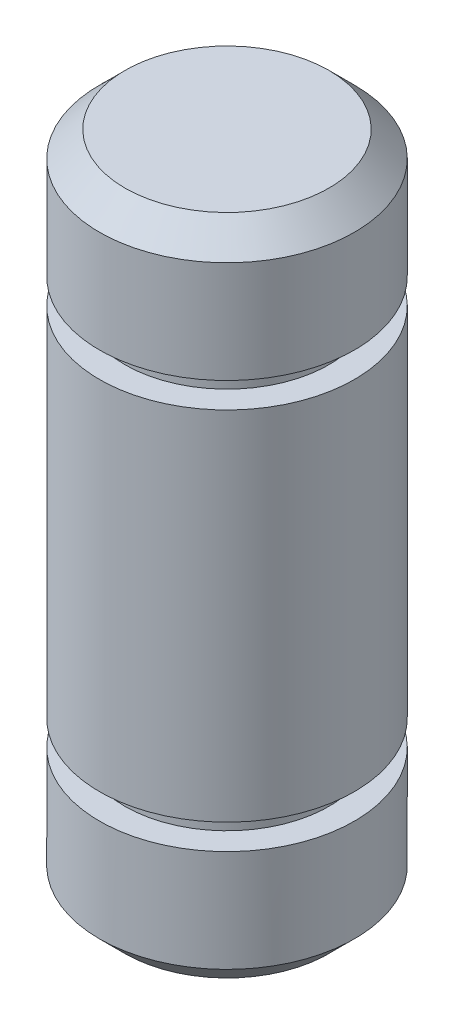
ISO-10303-21;
HEADER;
FILE_DESCRIPTION(('STEP AP214'),'2;1');
FILE_NAME('part.step','',(''),(''),'','','');
FILE_SCHEMA(('AUTOMOTIVE_DESIGN { 1 0 10303 214 1 1 1 1 }'));
ENDSEC;
DATA;
#1=APPLICATION_CONTEXT('core data for automotive mechanical design processes');
#2=APPLICATION_PROTOCOL_DEFINITION('international standard','automotive_design',2000,#1);
#3=PRODUCT_CONTEXT('',#1,'mechanical');
#4=PRODUCT('Part','Part','',(#3));
#5=PRODUCT_RELATED_PRODUCT_CATEGORY('part','',(#4));
#6=PRODUCT_DEFINITION_FORMATION('','',#4);
#7=PRODUCT_DEFINITION_CONTEXT('part definition',#1,'design');
#8=PRODUCT_DEFINITION('design','',#6,#7);
#9=PRODUCT_DEFINITION_SHAPE('','',#8);
#10=(LENGTH_UNIT() NAMED_UNIT(*) SI_UNIT(.MILLI.,.METRE.));
#11=(NAMED_UNIT(*) PLANE_ANGLE_UNIT() SI_UNIT($,.RADIAN.));
#12=(NAMED_UNIT(*) SI_UNIT($,.STERADIAN.) SOLID_ANGLE_UNIT());
#13=UNCERTAINTY_MEASURE_WITH_UNIT(LENGTH_MEASURE(1.E-05),#10,'distance_accuracy_value','');
#14=(GEOMETRIC_REPRESENTATION_CONTEXT(3) GLOBAL_UNCERTAINTY_ASSIGNED_CONTEXT((#13)) GLOBAL_UNIT_ASSIGNED_CONTEXT((#10,
#11,#12)) REPRESENTATION_CONTEXT('',''));
#15=CARTESIAN_POINT('',(0.,0.,0.));
#16=DIRECTION('',(0.,0.,1.));
#17=DIRECTION('',(1.,0.,0.));
#18=AXIS2_PLACEMENT_3D('',#15,#16,#17);
#19=CARTESIAN_POINT('',(0.,26.,0.));
#20=DIRECTION('',(0.,-1.,0.));
#21=DIRECTION('',(0.,0.,-1.));
#22=AXIS2_PLACEMENT_3D('',#19,#20,#21);
#23=CYLINDRICAL_SURFACE('',#22,5.);
#24=CARTESIAN_POINT('',(0.,20.,0.));
#25=DIRECTION('',(0.,-1.,0.));
#26=DIRECTION('',(0.,0.,-1.));
#27=AXIS2_PLACEMENT_3D('',#24,#25,#26);
#28=CIRCLE('',#27,5.);
#29=CARTESIAN_POINT('',(0.,20.,-5.));
#30=VERTEX_POINT('',#29);
#31=EDGE_CURVE('E73',#30,#30,#28,.T.);
#32=CARTESIAN_POINT('',(0.,6.,0.));
#33=DIRECTION('',(0.,-1.,0.));
#34=DIRECTION('',(0.,0.,-1.));
#35=AXIS2_PLACEMENT_3D('',#32,#33,#34);
#36=CIRCLE('',#35,5.);
#37=CARTESIAN_POINT('',(0.,6.00000000000001,-5.));
#38=VERTEX_POINT('',#37);
#39=EDGE_CURVE('E68',#38,#38,#36,.T.);
#40=CARTESIAN_POINT('',(0.,20.,-5.));
#41=CARTESIAN_POINT('',(0.,19.8541666666667,-5.));
#42=CARTESIAN_POINT('',(0.,19.7083333333333,-5.));
#43=CARTESIAN_POINT('',(0.,19.4166666666667,-5.));
#44=CARTESIAN_POINT('',(0.,19.2708333333333,-5.));
#45=CARTESIAN_POINT('',(0.,18.9791666666667,-5.));
#46=CARTESIAN_POINT('',(0.,18.8333333333333,-5.));
#47=CARTESIAN_POINT('',(0.,18.5416666666667,-5.));
#48=CARTESIAN_POINT('',(0.,18.3958333333333,-5.));
#49=CARTESIAN_POINT('',(0.,18.1041666666667,-5.));
#50=CARTESIAN_POINT('',(0.,17.9583333333333,-5.));
#51=CARTESIAN_POINT('',(0.,17.6666666666667,-5.));
#52=CARTESIAN_POINT('',(0.,17.5208333333333,-5.));
#53=CARTESIAN_POINT('',(0.,17.2291666666667,-5.));
#54=CARTESIAN_POINT('',(0.,17.0833333333333,-5.));
#55=CARTESIAN_POINT('',(0.,16.7916666666667,-5.));
#56=CARTESIAN_POINT('',(0.,16.6458333333333,-5.));
#57=CARTESIAN_POINT('',(0.,16.3541666666667,-5.));
#58=CARTESIAN_POINT('',(0.,16.2083333333333,-5.));
#59=CARTESIAN_POINT('',(0.,15.9166666666667,-5.));
#60=CARTESIAN_POINT('',(0.,15.7708333333333,-5.));
#61=CARTESIAN_POINT('',(0.,15.4791666666667,-5.));
#62=CARTESIAN_POINT('',(0.,15.3333333333333,-5.));
#63=CARTESIAN_POINT('',(0.,15.0416666666667,-5.));
#64=CARTESIAN_POINT('',(0.,14.8958333333333,-5.));
#65=CARTESIAN_POINT('',(0.,14.6041666666667,-5.));
#66=CARTESIAN_POINT('',(0.,14.4583333333333,-5.));
#67=CARTESIAN_POINT('',(0.,14.1666666666667,-5.));
#68=CARTESIAN_POINT('',(0.,14.0208333333333,-5.));
#69=CARTESIAN_POINT('',(0.,13.7291666666667,-5.));
#70=CARTESIAN_POINT('',(0.,13.5833333333333,-5.));
#71=CARTESIAN_POINT('',(0.,13.2916666666667,-5.));
#72=CARTESIAN_POINT('',(0.,13.1458333333333,-5.));
#73=CARTESIAN_POINT('',(0.,12.8541666666667,-5.));
#74=CARTESIAN_POINT('',(0.,12.7083333333333,-5.));
#75=CARTESIAN_POINT('',(0.,12.4166666666667,-5.));
#76=CARTESIAN_POINT('',(0.,12.2708333333333,-5.));
#77=CARTESIAN_POINT('',(0.,11.9791666666667,-5.));
#78=CARTESIAN_POINT('',(0.,11.8333333333333,-5.));
#79=CARTESIAN_POINT('',(0.,11.5416666666667,-5.));
#80=CARTESIAN_POINT('',(0.,11.3958333333333,-5.));
#81=CARTESIAN_POINT('',(0.,11.1041666666667,-5.));
#82=CARTESIAN_POINT('',(0.,10.9583333333333,-5.));
#83=CARTESIAN_POINT('',(0.,10.6666666666667,-5.));
#84=CARTESIAN_POINT('',(0.,10.5208333333333,-5.));
#85=CARTESIAN_POINT('',(0.,10.2291666666667,-5.));
#86=CARTESIAN_POINT('',(0.,10.0833333333333,-5.));
#87=CARTESIAN_POINT('',(0.,9.79166666666667,-5.));
#88=CARTESIAN_POINT('',(0.,9.64583333333334,-5.));
#89=CARTESIAN_POINT('',(0.,9.35416666666667,-5.));
#90=CARTESIAN_POINT('',(0.,9.20833333333334,-5.));
#91=CARTESIAN_POINT('',(0.,8.91666666666667,-5.));
#92=CARTESIAN_POINT('',(0.,8.77083333333334,-5.));
#93=CARTESIAN_POINT('',(0.,8.47916666666667,-5.));
#94=CARTESIAN_POINT('',(0.,8.33333333333334,-5.));
#95=CARTESIAN_POINT('',(0.,8.04166666666667,-5.));
#96=CARTESIAN_POINT('',(0.,7.89583333333334,-5.));
#97=CARTESIAN_POINT('',(0.,7.60416666666667,-5.));
#98=CARTESIAN_POINT('',(0.,7.45833333333334,-5.));
#99=CARTESIAN_POINT('',(0.,7.16666666666667,-5.));
#100=CARTESIAN_POINT('',(0.,7.02083333333334,-5.));
#101=CARTESIAN_POINT('',(0.,6.72916666666667,-5.));
#102=CARTESIAN_POINT('',(0.,6.58333333333334,-5.));
#103=CARTESIAN_POINT('',(0.,6.29166666666667,-5.));
#104=CARTESIAN_POINT('',(0.,6.14583333333334,-5.));
#105=CARTESIAN_POINT('',(0.,6.00000000000001,-5.));
#106=B_SPLINE_CURVE_WITH_KNOTS('',3,(#40,#41,#42,#43,#44,#45,#46,#47,#48,#49,#50,#51,#52,#53,
#54,#55,#56,#57,#58,#59,#60,#61,#62,#63,#64,#65,#66,#67,#68,#69,#70,#71,#72,#73,#74,#75,#76,#77,
#78,#79,#80,#81,#82,#83,#84,#85,#86,#87,#88,#89,#90,#91,#92,#93,#94,#95,#96,#97,#98,#99,#100,
#101,#102,#103,#104,#105),.UNSPECIFIED.,.F.,.F.,(4,2,2,2,2,2,2,2,2,2,2,2,2,2,2,2,2,2,2,2,2,2,2,
2,2,2,2,2,2,2,2,2,4),(0.,0.4375,0.874999999999997,1.3125,1.75,2.1875,2.625,3.0625,3.5,3.9375,
4.375,4.8125,5.25,5.6875,6.125,6.5625,7.,7.4375,7.875,8.3125,8.75,9.1875,9.625,10.0625,10.5,
10.9375,11.375,11.8125,12.25,12.6875,13.125,13.5625,14.),.UNSPECIFIED.);
#107=EDGE_CURVE('BSEAM43',#30,#38,#106,.T.);
#108=ORIENTED_EDGE('',*,*,#31,.T.);
#109=ORIENTED_EDGE('',*,*,#39,.F.);
#110=ORIENTED_EDGE('',*,*,#107,.T.);
#111=ORIENTED_EDGE('',*,*,#107,.F.);
#112=EDGE_LOOP('',(#108,#110,#109,#111));
#113=FACE_BOUND('',#112,.T.);
#114=ADVANCED_FACE('F43',(#113),#23,.T.);
#115=CARTESIAN_POINT('',(0.,6.,0.));
#116=DIRECTION('',(0.,-1.,0.));
#117=DIRECTION('',(0.,0.,-1.));
#118=AXIS2_PLACEMENT_3D('',#115,#116,#117);
#119=PLANE('',#118);
#120=CARTESIAN_POINT('',(0.,6.,0.));
#121=DIRECTION('',(0.,-1.,0.));
#122=DIRECTION('',(0.,0.,-1.));
#123=AXIS2_PLACEMENT_3D('',#120,#121,#122);
#124=CIRCLE('',#123,4.);
#125=CARTESIAN_POINT('',(0.,6.,-4.));
#126=VERTEX_POINT('',#125);
#127=EDGE_CURVE('E69',#126,#126,#124,.T.);
#128=ORIENTED_EDGE('',*,*,#127,.F.);
#129=EDGE_LOOP('',(#128));
#130=FACE_BOUND('',#129,.T.);
#131=ORIENTED_EDGE('',*,*,#39,.T.);
#132=EDGE_LOOP('',(#131));
#133=FACE_BOUND('',#132,.T.);
#134=ADVANCED_FACE('F125',(#130,#133),#119,.T.);
#135=CARTESIAN_POINT('',(0.,5.,0.));
#136=DIRECTION('',(0.,-1.,0.));
#137=DIRECTION('',(0.,0.,-1.));
#138=AXIS2_PLACEMENT_3D('',#135,#136,#137);
#139=PLANE('',#138);
#140=CARTESIAN_POINT('',(0.,5.,0.));
#141=DIRECTION('',(0.,-1.,0.));
#142=DIRECTION('',(0.,0.,-1.));
#143=AXIS2_PLACEMENT_3D('',#140,#141,#142);
#144=CIRCLE('',#143,4.);
#145=CARTESIAN_POINT('',(0.,5.,-4.));
#146=VERTEX_POINT('',#145);
#147=EDGE_CURVE('E82',#146,#146,#144,.T.);
#148=ORIENTED_EDGE('',*,*,#147,.T.);
#149=EDGE_LOOP('',(#148));
#150=FACE_BOUND('',#149,.T.);
#151=CARTESIAN_POINT('',(0.,5.,0.));
#152=DIRECTION('',(0.,-1.,0.));
#153=DIRECTION('',(0.,0.,-1.));
#154=AXIS2_PLACEMENT_3D('',#151,#152,#153);
#155=CIRCLE('',#154,5.);
#156=CARTESIAN_POINT('',(0.,5.,-5.));
#157=VERTEX_POINT('',#156);
#158=EDGE_CURVE('E64',#157,#157,#155,.T.);
#159=ORIENTED_EDGE('',*,*,#158,.F.);
#160=EDGE_LOOP('',(#159));
#161=FACE_BOUND('',#160,.T.);
#162=ADVANCED_FACE('F129',(#150,#161),#139,.F.);
#163=CARTESIAN_POINT('',(0.,6.,0.));
#164=DIRECTION('',(0.,-1.,0.));
#165=DIRECTION('',(0.,0.,-1.));
#166=AXIS2_PLACEMENT_3D('',#163,#164,#165);
#167=CYLINDRICAL_SURFACE('',#166,4.);
#168=ORIENTED_EDGE('',*,*,#127,.T.);
#169=EDGE_LOOP('',(#168));
#170=FACE_BOUND('',#169,.T.);
#171=ORIENTED_EDGE('',*,*,#147,.F.);
#172=EDGE_LOOP('',(#171));
#173=FACE_BOUND('',#172,.T.);
#174=ADVANCED_FACE('F119',(#170,#173),#167,.T.);
#175=CARTESIAN_POINT('',(0.,0.,0.));
#176=DIRECTION('',(0.,1.,0.));
#177=DIRECTION('',(0.,0.,1.));
#178=AXIS2_PLACEMENT_3D('',#175,#176,#177);
#179=PLANE('',#178);
#180=CARTESIAN_POINT('',(0.,0.,0.));
#181=DIRECTION('',(0.,1.,0.));
#182=DIRECTION('',(0.,0.,1.));
#183=AXIS2_PLACEMENT_3D('',#180,#181,#182);
#184=CIRCLE('',#183,3.99999999999998);
#185=CARTESIAN_POINT('',(0.,0.,3.99999999999998));
#186=VERTEX_POINT('',#185);
#187=EDGE_CURVE('E53',#186,#186,#184,.F.);
#188=ORIENTED_EDGE('',*,*,#187,.T.);
#189=EDGE_LOOP('',(#188));
#190=FACE_BOUND('',#189,.T.);
#191=ADVANCED_FACE('F109',(#190),#179,.F.);
#192=CARTESIAN_POINT('',(0.,1.00000000000002,0.));
#193=DIRECTION('',(0.,1.,0.));
#194=DIRECTION('',(0.,0.,1.));
#195=AXIS2_PLACEMENT_3D('',#192,#193,#194);
#196=CONICAL_SURFACE('',#195,5.,0.78539816339745);
#197=ORIENTED_EDGE('',*,*,#187,.F.);
#198=EDGE_LOOP('',(#197));
#199=FACE_BOUND('',#198,.T.);
#200=CARTESIAN_POINT('',(0.,1.00000000000002,0.));
#201=DIRECTION('',(0.,1.,0.));
#202=DIRECTION('',(0.,0.,1.));
#203=AXIS2_PLACEMENT_3D('',#200,#201,#202);
#204=CIRCLE('',#203,5.);
#205=CARTESIAN_POINT('',(0.,1.00000000000002,-5.));
#206=VERTEX_POINT('',#205);
#207=EDGE_CURVE('E60',#206,#206,#204,.T.);
#208=ORIENTED_EDGE('',*,*,#207,.F.);
#209=EDGE_LOOP('',(#208));
#210=FACE_BOUND('',#209,.T.);
#211=ADVANCED_FACE('F107',(#199,#210),#196,.T.);
#212=CARTESIAN_POINT('',(0.,5.,-5.));
#213=CARTESIAN_POINT('',(0.,4.95833333333334,-5.));
#214=CARTESIAN_POINT('',(0.,4.91666666666667,-5.));
#215=CARTESIAN_POINT('',(0.,4.83333333333334,-5.));
#216=CARTESIAN_POINT('',(0.,4.79166666666667,-5.));
#217=CARTESIAN_POINT('',(0.,4.70833333333334,-5.));
#218=CARTESIAN_POINT('',(0.,4.66666666666667,-5.));
#219=CARTESIAN_POINT('',(0.,4.58333333333334,-5.));
#220=CARTESIAN_POINT('',(0.,4.54166666666667,-5.));
#221=CARTESIAN_POINT('',(0.,4.45833333333334,-5.));
#222=CARTESIAN_POINT('',(0.,4.41666666666667,-5.));
#223=CARTESIAN_POINT('',(0.,4.33333333333334,-5.));
#224=CARTESIAN_POINT('',(0.,4.29166666666667,-5.));
#225=CARTESIAN_POINT('',(0.,4.20833333333334,-5.));
#226=CARTESIAN_POINT('',(0.,4.16666666666667,-5.));
#227=CARTESIAN_POINT('',(0.,4.08333333333334,-5.));
#228=CARTESIAN_POINT('',(0.,4.04166666666668,-5.));
#229=CARTESIAN_POINT('',(0.,3.95833333333334,-5.));
#230=CARTESIAN_POINT('',(0.,3.91666666666668,-5.));
#231=CARTESIAN_POINT('',(0.,3.83333333333334,-5.));
#232=CARTESIAN_POINT('',(0.,3.79166666666668,-5.));
#233=CARTESIAN_POINT('',(0.,3.70833333333334,-5.));
#234=CARTESIAN_POINT('',(0.,3.66666666666668,-5.));
#235=CARTESIAN_POINT('',(0.,3.58333333333334,-5.));
#236=CARTESIAN_POINT('',(0.,3.54166666666668,-5.));
#237=CARTESIAN_POINT('',(0.,3.45833333333334,-5.));
#238=CARTESIAN_POINT('',(0.,3.41666666666668,-5.));
#239=CARTESIAN_POINT('',(0.,3.33333333333334,-5.));
#240=CARTESIAN_POINT('',(0.,3.29166666666668,-5.));
#241=CARTESIAN_POINT('',(0.,3.20833333333335,-5.));
#242=CARTESIAN_POINT('',(0.,3.16666666666668,-5.));
#243=CARTESIAN_POINT('',(0.,3.08333333333335,-5.));
#244=CARTESIAN_POINT('',(0.,3.04166666666668,-5.));
#245=CARTESIAN_POINT('',(0.,2.95833333333335,-5.));
#246=CARTESIAN_POINT('',(0.,2.91666666666668,-5.));
#247=CARTESIAN_POINT('',(0.,2.83333333333335,-5.));
#248=CARTESIAN_POINT('',(0.,2.79166666666668,-5.));
#249=CARTESIAN_POINT('',(0.,2.70833333333335,-5.));
#250=CARTESIAN_POINT('',(0.,2.66666666666668,-5.));
#251=CARTESIAN_POINT('',(0.,2.58333333333335,-5.));
#252=CARTESIAN_POINT('',(0.,2.54166666666668,-5.));
#253=CARTESIAN_POINT('',(0.,2.45833333333335,-5.));
#254=CARTESIAN_POINT('',(0.,2.41666666666668,-5.));
#255=CARTESIAN_POINT('',(0.,2.33333333333335,-5.));
#256=CARTESIAN_POINT('',(0.,2.29166666666668,-5.));
#257=CARTESIAN_POINT('',(0.,2.20833333333335,-5.));
#258=CARTESIAN_POINT('',(0.,2.16666666666668,-5.));
#259=CARTESIAN_POINT('',(0.,2.08333333333335,-5.));
#260=CARTESIAN_POINT('',(0.,2.04166666666668,-5.));
#261=CARTESIAN_POINT('',(0.,1.95833333333335,-5.));
#262=CARTESIAN_POINT('',(0.,1.91666666666668,-5.));
#263=CARTESIAN_POINT('',(0.,1.83333333333335,-5.));
#264=CARTESIAN_POINT('',(0.,1.79166666666669,-5.));
#265=CARTESIAN_POINT('',(0.,1.70833333333335,-5.));
#266=CARTESIAN_POINT('',(0.,1.66666666666669,-5.));
#267=CARTESIAN_POINT('',(0.,1.58333333333335,-5.));
#268=CARTESIAN_POINT('',(0.,1.54166666666669,-5.));
#269=CARTESIAN_POINT('',(0.,1.45833333333335,-5.));
#270=CARTESIAN_POINT('',(0.,1.41666666666669,-5.));
#271=CARTESIAN_POINT('',(0.,1.33333333333336,-5.));
#272=CARTESIAN_POINT('',(0.,1.29166666666669,-5.));
#273=CARTESIAN_POINT('',(0.,1.20833333333336,-5.));
#274=CARTESIAN_POINT('',(0.,1.16666666666669,-5.));
#275=CARTESIAN_POINT('',(0.,1.08333333333336,-5.));
#276=CARTESIAN_POINT('',(0.,1.04166666666669,-5.));
#277=CARTESIAN_POINT('',(0.,1.00000000000002,-5.));
#278=B_SPLINE_CURVE_WITH_KNOTS('',3,(#212,#213,#214,#215,#216,#217,#218,#219,#220,#221,#222,
#223,#224,#225,#226,#227,#228,#229,#230,#231,#232,#233,#234,#235,#236,#237,#238,#239,#240,#241,
#242,#243,#244,#245,#246,#247,#248,#249,#250,#251,#252,#253,#254,#255,#256,#257,#258,#259,#260,
#261,#262,#263,#264,#265,#266,#267,#268,#269,#270,#271,#272,#273,#274,#275,#276,#277),
.UNSPECIFIED.,.F.,.F.,(4,2,2,2,2,2,2,2,2,2,2,2,2,2,2,2,2,2,2,2,2,2,2,2,2,2,2,2,2,2,2,2,4),(0.,
0.125,0.25,0.374999999999997,0.499999999999997,0.624999999999997,0.749999999999997,
0.874999999999997,0.999999999999994,1.12499999999999,1.24999999999999,1.37499999999999,
1.49999999999999,1.62499999999999,1.74999999999999,1.87499999999999,1.99999999999999,
2.12499999999999,2.24999999999999,2.37499999999999,2.49999999999999,2.62499999999999,
2.74999999999999,2.87499999999999,2.99999999999999,3.12499999999999,3.24999999999999,
3.37499999999999,3.49999999999999,3.62499999999998,3.74999999999998,3.87499999999998,
3.99999999999998),.UNSPECIFIED.);
#279=EDGE_CURVE('BSEAM105',#157,#206,#278,.T.);
#280=ORIENTED_EDGE('',*,*,#158,.T.);
#281=ORIENTED_EDGE('',*,*,#207,.T.);
#282=ORIENTED_EDGE('',*,*,#279,.T.);
#283=ORIENTED_EDGE('',*,*,#279,.F.);
#284=EDGE_LOOP('',(#280,#282,#281,#283));
#285=FACE_BOUND('',#284,.T.);
#286=ADVANCED_FACE('F105',(#285),#23,.T.);
#287=CARTESIAN_POINT('',(0.,21.,0.));
#288=DIRECTION('',(0.,-1.,0.));
#289=DIRECTION('',(0.,0.,-1.));
#290=AXIS2_PLACEMENT_3D('',#287,#288,#289);
#291=PLANE('',#290);
#292=CARTESIAN_POINT('',(0.,21.,0.));
#293=DIRECTION('',(0.,-1.,0.));
#294=DIRECTION('',(0.,0.,-1.));
#295=AXIS2_PLACEMENT_3D('',#292,#293,#294);
#296=CIRCLE('',#295,4.);
#297=CARTESIAN_POINT('',(0.,21.,-4.));
#298=VERTEX_POINT('',#297);
#299=EDGE_CURVE('E76',#298,#298,#296,.T.);
#300=ORIENTED_EDGE('',*,*,#299,.F.);
#301=EDGE_LOOP('',(#300));
#302=FACE_BOUND('',#301,.T.);
#303=CARTESIAN_POINT('',(0.,21.,0.));
#304=DIRECTION('',(0.,-1.,0.));
#305=DIRECTION('',(0.,0.,-1.));
#306=AXIS2_PLACEMENT_3D('',#303,#304,#305);
#307=CIRCLE('',#306,5.);
#308=CARTESIAN_POINT('',(0.,21.,-5.));
#309=VERTEX_POINT('',#308);
#310=EDGE_CURVE('E48',#309,#309,#307,.T.);
#311=ORIENTED_EDGE('',*,*,#310,.T.);
#312=EDGE_LOOP('',(#311));
#313=FACE_BOUND('',#312,.T.);
#314=ADVANCED_FACE('F115',(#302,#313),#291,.T.);
#315=CARTESIAN_POINT('',(0.,20.,0.));
#316=DIRECTION('',(0.,-1.,0.));
#317=DIRECTION('',(0.,0.,-1.));
#318=AXIS2_PLACEMENT_3D('',#315,#316,#317);
#319=PLANE('',#318);
#320=CARTESIAN_POINT('',(0.,20.,0.));
#321=DIRECTION('',(0.,-1.,0.));
#322=DIRECTION('',(0.,0.,-1.));
#323=AXIS2_PLACEMENT_3D('',#320,#321,#322);
#324=CIRCLE('',#323,4.);
#325=CARTESIAN_POINT('',(0.,20.,-4.));
#326=VERTEX_POINT('',#325);
#327=EDGE_CURVE('E84',#326,#326,#324,.T.);
#328=ORIENTED_EDGE('',*,*,#327,.T.);
#329=EDGE_LOOP('',(#328));
#330=FACE_BOUND('',#329,.T.);
#331=ORIENTED_EDGE('',*,*,#31,.F.);
#332=EDGE_LOOP('',(#331));
#333=FACE_BOUND('',#332,.T.);
#334=ADVANCED_FACE('F145',(#330,#333),#319,.F.);
#335=CARTESIAN_POINT('',(0.,21.,0.));
#336=DIRECTION('',(0.,-1.,0.));
#337=DIRECTION('',(0.,0.,-1.));
#338=AXIS2_PLACEMENT_3D('',#335,#336,#337);
#339=CYLINDRICAL_SURFACE('',#338,4.);
#340=ORIENTED_EDGE('',*,*,#299,.T.);
#341=EDGE_LOOP('',(#340));
#342=FACE_BOUND('',#341,.T.);
#343=ORIENTED_EDGE('',*,*,#327,.F.);
#344=EDGE_LOOP('',(#343));
#345=FACE_BOUND('',#344,.T.);
#346=ADVANCED_FACE('F151',(#342,#345),#339,.T.);
#347=CARTESIAN_POINT('',(0.,26.,0.));
#348=DIRECTION('',(0.,1.,0.));
#349=DIRECTION('',(0.,0.,1.));
#350=AXIS2_PLACEMENT_3D('',#347,#348,#349);
#351=PLANE('',#350);
#352=CARTESIAN_POINT('',(0.,26.,0.));
#353=DIRECTION('',(0.,1.,0.));
#354=DIRECTION('',(0.,0.,1.));
#355=AXIS2_PLACEMENT_3D('',#352,#353,#354);
#356=CIRCLE('',#355,4.00000000000002);
#357=CARTESIAN_POINT('',(0.,26.,4.00000000000002));
#358=VERTEX_POINT('',#357);
#359=EDGE_CURVE('E10',#358,#358,#356,.T.);
#360=ORIENTED_EDGE('',*,*,#359,.T.);
#361=EDGE_LOOP('',(#360));
#362=FACE_BOUND('',#361,.T.);
#363=ADVANCED_FACE('F138',(#362),#351,.T.);
#364=CARTESIAN_POINT('',(0.,26.,0.));
#365=DIRECTION('',(0.,-1.,0.));
#366=DIRECTION('',(0.,0.,-1.));
#367=AXIS2_PLACEMENT_3D('',#364,#365,#366);
#368=CONICAL_SURFACE('',#367,4.00000000000002,0.785398163397447);
#369=CARTESIAN_POINT('',(0.,25.,0.));
#370=DIRECTION('',(0.,1.,0.));
#371=DIRECTION('',(0.,0.,1.));
#372=AXIS2_PLACEMENT_3D('',#369,#370,#371);
#373=CIRCLE('',#372,5.);
#374=CARTESIAN_POINT('',(0.,25.,-5.));
#375=VERTEX_POINT('',#374);
#376=EDGE_CURVE('E72',#375,#375,#373,.F.);
#377=ORIENTED_EDGE('',*,*,#376,.F.);
#378=EDGE_LOOP('',(#377));
#379=FACE_BOUND('',#378,.T.);
#380=ORIENTED_EDGE('',*,*,#359,.F.);
#381=EDGE_LOOP('',(#380));
#382=FACE_BOUND('',#381,.T.);
#383=ADVANCED_FACE('F46',(#379,#382),#368,.T.);
#384=CARTESIAN_POINT('',(0.,25.,-5.));
#385=CARTESIAN_POINT('',(0.,24.9583333333333,-5.));
#386=CARTESIAN_POINT('',(0.,24.9166666666667,-5.));
#387=CARTESIAN_POINT('',(0.,24.8333333333333,-5.));
#388=CARTESIAN_POINT('',(0.,24.7916666666667,-5.));
#389=CARTESIAN_POINT('',(0.,24.7083333333333,-5.));
#390=CARTESIAN_POINT('',(0.,24.6666666666667,-5.));
#391=CARTESIAN_POINT('',(0.,24.5833333333333,-5.));
#392=CARTESIAN_POINT('',(0.,24.5416666666667,-5.));
#393=CARTESIAN_POINT('',(0.,24.4583333333333,-5.));
#394=CARTESIAN_POINT('',(0.,24.4166666666667,-5.));
#395=CARTESIAN_POINT('',(0.,24.3333333333333,-5.));
#396=CARTESIAN_POINT('',(0.,24.2916666666667,-5.));
#397=CARTESIAN_POINT('',(0.,24.2083333333333,-5.));
#398=CARTESIAN_POINT('',(0.,24.1666666666667,-5.));
#399=CARTESIAN_POINT('',(0.,24.0833333333333,-5.));
#400=CARTESIAN_POINT('',(0.,24.0416666666667,-5.));
#401=CARTESIAN_POINT('',(0.,23.9583333333333,-5.));
#402=CARTESIAN_POINT('',(0.,23.9166666666667,-5.));
#403=CARTESIAN_POINT('',(0.,23.8333333333333,-5.));
#404=CARTESIAN_POINT('',(0.,23.7916666666667,-5.));
#405=CARTESIAN_POINT('',(0.,23.7083333333333,-5.));
#406=CARTESIAN_POINT('',(0.,23.6666666666667,-5.));
#407=CARTESIAN_POINT('',(0.,23.5833333333333,-5.));
#408=CARTESIAN_POINT('',(0.,23.5416666666667,-5.));
#409=CARTESIAN_POINT('',(0.,23.4583333333333,-5.));
#410=CARTESIAN_POINT('',(0.,23.4166666666667,-5.));
#411=CARTESIAN_POINT('',(0.,23.3333333333333,-5.));
#412=CARTESIAN_POINT('',(0.,23.2916666666667,-5.));
#413=CARTESIAN_POINT('',(0.,23.2083333333333,-5.));
#414=CARTESIAN_POINT('',(0.,23.1666666666667,-5.));
#415=CARTESIAN_POINT('',(0.,23.0833333333333,-5.));
#416=CARTESIAN_POINT('',(0.,23.0416666666667,-5.));
#417=CARTESIAN_POINT('',(0.,22.9583333333333,-5.));
#418=CARTESIAN_POINT('',(0.,22.9166666666667,-5.));
#419=CARTESIAN_POINT('',(0.,22.8333333333333,-5.));
#420=CARTESIAN_POINT('',(0.,22.7916666666667,-5.));
#421=CARTESIAN_POINT('',(0.,22.7083333333333,-5.));
#422=CARTESIAN_POINT('',(0.,22.6666666666667,-5.));
#423=CARTESIAN_POINT('',(0.,22.5833333333333,-5.));
#424=CARTESIAN_POINT('',(0.,22.5416666666667,-5.));
#425=CARTESIAN_POINT('',(0.,22.4583333333333,-5.));
#426=CARTESIAN_POINT('',(0.,22.4166666666667,-5.));
#427=CARTESIAN_POINT('',(0.,22.3333333333333,-5.));
#428=CARTESIAN_POINT('',(0.,22.2916666666667,-5.));
#429=CARTESIAN_POINT('',(0.,22.2083333333333,-5.));
#430=CARTESIAN_POINT('',(0.,22.1666666666667,-5.));
#431=CARTESIAN_POINT('',(0.,22.0833333333333,-5.));
#432=CARTESIAN_POINT('',(0.,22.0416666666667,-5.));
#433=CARTESIAN_POINT('',(0.,21.9583333333333,-5.));
#434=CARTESIAN_POINT('',(0.,21.9166666666667,-5.));
#435=CARTESIAN_POINT('',(0.,21.8333333333333,-5.));
#436=CARTESIAN_POINT('',(0.,21.7916666666667,-5.));
#437=CARTESIAN_POINT('',(0.,21.7083333333333,-5.));
#438=CARTESIAN_POINT('',(0.,21.6666666666667,-5.));
#439=CARTESIAN_POINT('',(0.,21.5833333333333,-5.));
#440=CARTESIAN_POINT('',(0.,21.5416666666667,-5.));
#441=CARTESIAN_POINT('',(0.,21.4583333333333,-5.));
#442=CARTESIAN_POINT('',(0.,21.4166666666667,-5.));
#443=CARTESIAN_POINT('',(0.,21.3333333333333,-5.));
#444=CARTESIAN_POINT('',(0.,21.2916666666667,-5.));
#445=CARTESIAN_POINT('',(0.,21.2083333333333,-5.));
#446=CARTESIAN_POINT('',(0.,21.1666666666667,-5.));
#447=CARTESIAN_POINT('',(0.,21.0833333333333,-5.));
#448=CARTESIAN_POINT('',(0.,21.0416666666667,-5.));
#449=CARTESIAN_POINT('',(0.,21.,-5.));
#450=B_SPLINE_CURVE_WITH_KNOTS('',3,(#384,#385,#386,#387,#388,#389,#390,#391,#392,#393,#394,
#395,#396,#397,#398,#399,#400,#401,#402,#403,#404,#405,#406,#407,#408,#409,#410,#411,#412,#413,
#414,#415,#416,#417,#418,#419,#420,#421,#422,#423,#424,#425,#426,#427,#428,#429,#430,#431,#432,
#433,#434,#435,#436,#437,#438,#439,#440,#441,#442,#443,#444,#445,#446,#447,#448,#449),
.UNSPECIFIED.,.F.,.F.,(4,2,2,2,2,2,2,2,2,2,2,2,2,2,2,2,2,2,2,2,2,2,2,2,2,2,2,2,2,2,2,2,4),(0.,
0.125000000000004,0.250000000000004,0.375000000000004,0.500000000000004,0.625000000000004,
0.750000000000004,0.875000000000004,1.,1.125,1.25,1.37500000000001,1.50000000000001,
1.62500000000001,1.75000000000001,1.87500000000001,2.00000000000001,2.12500000000001,
2.25000000000001,2.37500000000001,2.50000000000001,2.62500000000001,2.75000000000001,
2.87500000000001,3.00000000000001,3.12500000000001,3.25000000000001,3.37500000000001,
3.50000000000001,3.62500000000001,3.75000000000001,3.87500000000002,4.00000000000002),.UNSPECIFIED.);
#451=EDGE_CURVE('BSEAM118',#375,#309,#450,.T.);
#452=ORIENTED_EDGE('',*,*,#376,.T.);
#453=ORIENTED_EDGE('',*,*,#310,.F.);
#454=ORIENTED_EDGE('',*,*,#451,.T.);
#455=ORIENTED_EDGE('',*,*,#451,.F.);
#456=EDGE_LOOP('',(#452,#454,#453,#455));
#457=FACE_BOUND('',#456,.T.);
#458=ADVANCED_FACE('F118',(#457),#23,.T.);
#459=CLOSED_SHELL('',(#114,#134,#162,#174,#191,#211,#286,#314,#334,#346,#363,#383,#458));
#460=MANIFOLD_SOLID_BREP('B2',#459);
#461=ADVANCED_BREP_SHAPE_REPRESENTATION('',(#18,#460),#14);
#462=SHAPE_DEFINITION_REPRESENTATION(#9,#461);
ENDSEC;
END-ISO-10303-21;
